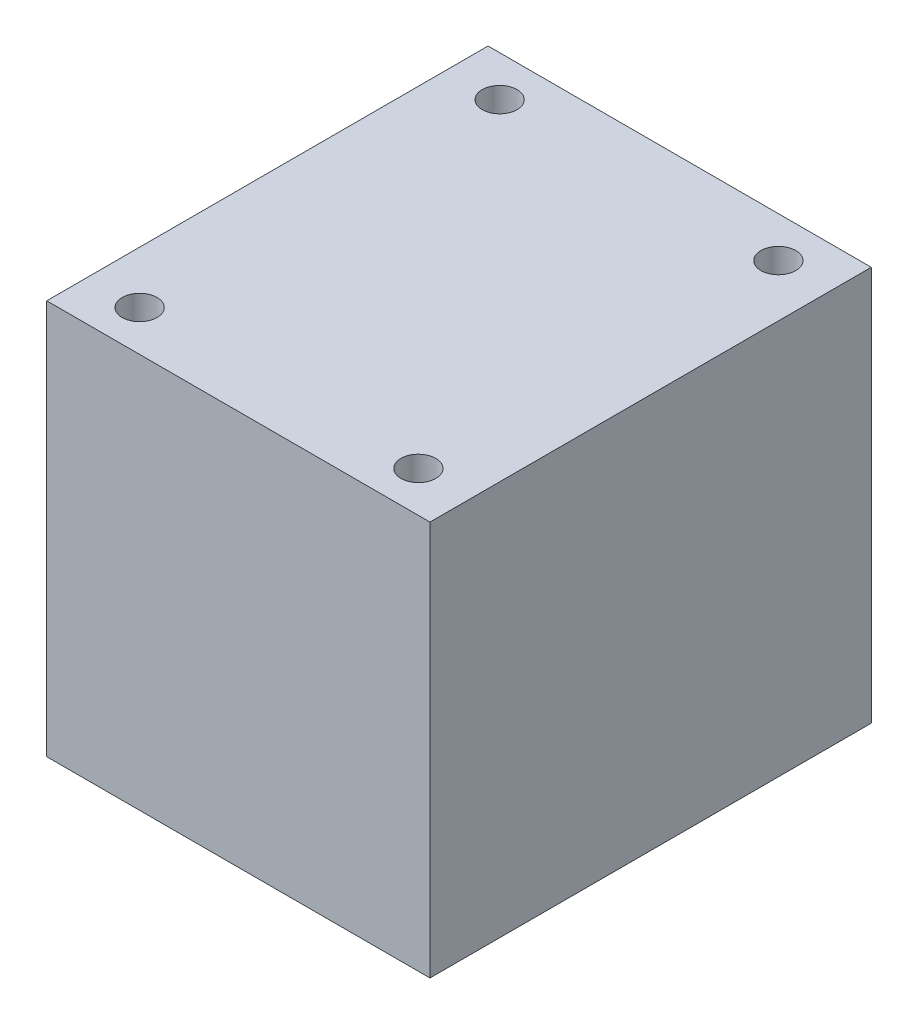
ISO-10303-21;
HEADER;
FILE_DESCRIPTION(('STEP AP214'),'2;1');
FILE_NAME('part.step','',(''),(''),'','','');
FILE_SCHEMA(('AUTOMOTIVE_DESIGN { 1 0 10303 214 1 1 1 1 }'));
ENDSEC;
DATA;
#1=APPLICATION_CONTEXT('core data for automotive mechanical design processes');
#2=APPLICATION_PROTOCOL_DEFINITION('international standard','automotive_design',2000,#1);
#3=PRODUCT_CONTEXT('',#1,'mechanical');
#4=PRODUCT('Part','Part','',(#3));
#5=PRODUCT_RELATED_PRODUCT_CATEGORY('part','',(#4));
#6=PRODUCT_DEFINITION_FORMATION('','',#4);
#7=PRODUCT_DEFINITION_CONTEXT('part definition',#1,'design');
#8=PRODUCT_DEFINITION('design','',#6,#7);
#9=PRODUCT_DEFINITION_SHAPE('','',#8);
#10=(LENGTH_UNIT() NAMED_UNIT(*) SI_UNIT(.MILLI.,.METRE.));
#11=(NAMED_UNIT(*) PLANE_ANGLE_UNIT() SI_UNIT($,.RADIAN.));
#12=(NAMED_UNIT(*) SI_UNIT($,.STERADIAN.) SOLID_ANGLE_UNIT());
#13=UNCERTAINTY_MEASURE_WITH_UNIT(LENGTH_MEASURE(1.E-05),#10,'distance_accuracy_value','');
#14=(GEOMETRIC_REPRESENTATION_CONTEXT(3) GLOBAL_UNCERTAINTY_ASSIGNED_CONTEXT((#13)) GLOBAL_UNIT_ASSIGNED_CONTEXT((#10,
#11,#12)) REPRESENTATION_CONTEXT('',''));
#15=CARTESIAN_POINT('',(0.,0.,0.));
#16=DIRECTION('',(0.,0.,1.));
#17=DIRECTION('',(1.,0.,0.));
#18=AXIS2_PLACEMENT_3D('',#15,#16,#17);
#19=CARTESIAN_POINT('',(0.,34.,0.));
#20=DIRECTION('',(0.,1.,0.));
#21=DIRECTION('',(0.,0.,1.));
#22=AXIS2_PLACEMENT_3D('',#19,#20,#21);
#23=PLANE('',#22);
#24=CARTESIAN_POINT('',(4.5,34.,34.5));
#25=DIRECTION('',(0.,1.,0.));
#26=DIRECTION('',(0.,0.,1.));
#27=AXIS2_PLACEMENT_3D('',#24,#25,#26);
#28=CIRCLE('',#27,1.5);
#29=CARTESIAN_POINT('',(4.5,34.,36.));
#30=VERTEX_POINT('',#29);
#31=EDGE_CURVE('E142',#30,#30,#28,.T.);
#32=ORIENTED_EDGE('',*,*,#31,.F.);
#33=EDGE_LOOP('',(#32));
#34=FACE_BOUND('',#33,.T.);
#35=CARTESIAN_POINT('',(28.5,34.,3.5));
#36=DIRECTION('',(0.,1.,0.));
#37=DIRECTION('',(0.,0.,1.));
#38=AXIS2_PLACEMENT_3D('',#35,#36,#37);
#39=CIRCLE('',#38,1.5);
#40=CARTESIAN_POINT('',(28.5,34.,5.));
#41=VERTEX_POINT('',#40);
#42=EDGE_CURVE('E112',#41,#41,#39,.T.);
#43=ORIENTED_EDGE('',*,*,#42,.F.);
#44=EDGE_LOOP('',(#43));
#45=FACE_BOUND('',#44,.T.);
#46=DIRECTION('',(0.,0.,1.));
#47=VECTOR('',#46,1.);
#48=CARTESIAN_POINT('',(0.,34.,0.));
#49=LINE('',#48,#47);
#50=CARTESIAN_POINT('',(0.,34.,0.));
#51=VERTEX_POINT('',#50);
#52=CARTESIAN_POINT('',(0.,34.,38.));
#53=VERTEX_POINT('',#52);
#54=EDGE_CURVE('E92',#51,#53,#49,.T.);
#55=ORIENTED_EDGE('',*,*,#54,.T.);
#56=DIRECTION('',(1.,0.,0.));
#57=VECTOR('',#56,1.);
#58=CARTESIAN_POINT('',(0.,34.,38.));
#59=LINE('',#58,#57);
#60=CARTESIAN_POINT('',(33.,34.,38.));
#61=VERTEX_POINT('',#60);
#62=EDGE_CURVE('E87',#53,#61,#59,.T.);
#63=ORIENTED_EDGE('',*,*,#62,.T.);
#64=DIRECTION('',(0.,0.,-1.));
#65=VECTOR('',#64,1.);
#66=CARTESIAN_POINT('',(33.,34.,0.));
#67=LINE('',#66,#65);
#68=CARTESIAN_POINT('',(33.,34.,0.));
#69=VERTEX_POINT('',#68);
#70=EDGE_CURVE('E90',#61,#69,#67,.T.);
#71=ORIENTED_EDGE('',*,*,#70,.T.);
#72=DIRECTION('',(-1.,0.,0.));
#73=VECTOR('',#72,1.);
#74=CARTESIAN_POINT('',(0.,34.,0.));
#75=LINE('',#74,#73);
#76=EDGE_CURVE('E57',#69,#51,#75,.T.);
#77=ORIENTED_EDGE('',*,*,#76,.T.);
#78=EDGE_LOOP('',(#55,#63,#71,#77));
#79=FACE_BOUND('',#78,.T.);
#80=CARTESIAN_POINT('',(28.5,34.,34.5));
#81=DIRECTION('',(0.,1.,0.));
#82=DIRECTION('',(0.,0.,1.));
#83=AXIS2_PLACEMENT_3D('',#80,#81,#82);
#84=CIRCLE('',#83,1.5);
#85=CARTESIAN_POINT('',(28.5,34.,36.));
#86=VERTEX_POINT('',#85);
#87=EDGE_CURVE('E134',#86,#86,#84,.T.);
#88=ORIENTED_EDGE('',*,*,#87,.F.);
#89=EDGE_LOOP('',(#88));
#90=FACE_BOUND('',#89,.T.);
#91=CARTESIAN_POINT('',(4.5,34.,3.5));
#92=DIRECTION('',(0.,1.,0.));
#93=DIRECTION('',(0.,0.,1.));
#94=AXIS2_PLACEMENT_3D('',#91,#92,#93);
#95=CIRCLE('',#94,1.5);
#96=CARTESIAN_POINT('',(4.5,34.,5.));
#97=VERTEX_POINT('',#96);
#98=EDGE_CURVE('E150',#97,#97,#95,.T.);
#99=ORIENTED_EDGE('',*,*,#98,.F.);
#100=EDGE_LOOP('',(#99));
#101=FACE_BOUND('',#100,.T.);
#102=ADVANCED_FACE('F39',(#34,#45,#79,#90,#101),#23,.T.);
#103=CARTESIAN_POINT('',(0.,0.,0.));
#104=DIRECTION('',(0.,1.,0.));
#105=DIRECTION('',(0.,0.,1.));
#106=AXIS2_PLACEMENT_3D('',#103,#104,#105);
#107=PLANE('',#106);
#108=DIRECTION('',(0.,0.,1.));
#109=VECTOR('',#108,1.);
#110=CARTESIAN_POINT('',(0.,0.,0.));
#111=LINE('',#110,#109);
#112=CARTESIAN_POINT('',(0.,0.,0.));
#113=VERTEX_POINT('',#112);
#114=CARTESIAN_POINT('',(0.,0.,38.));
#115=VERTEX_POINT('',#114);
#116=EDGE_CURVE('E108',#113,#115,#111,.T.);
#117=ORIENTED_EDGE('',*,*,#116,.F.);
#118=DIRECTION('',(-1.,0.,0.));
#119=VECTOR('',#118,1.);
#120=CARTESIAN_POINT('',(0.,0.,0.));
#121=LINE('',#120,#119);
#122=CARTESIAN_POINT('',(33.,0.,0.));
#123=VERTEX_POINT('',#122);
#124=EDGE_CURVE('E80',#123,#113,#121,.T.);
#125=ORIENTED_EDGE('',*,*,#124,.F.);
#126=DIRECTION('',(0.,0.,-1.));
#127=VECTOR('',#126,1.);
#128=CARTESIAN_POINT('',(33.,0.,0.));
#129=LINE('',#128,#127);
#130=CARTESIAN_POINT('',(33.,0.,38.));
#131=VERTEX_POINT('',#130);
#132=EDGE_CURVE('E74',#131,#123,#129,.T.);
#133=ORIENTED_EDGE('',*,*,#132,.F.);
#134=DIRECTION('',(1.,0.,0.));
#135=VECTOR('',#134,1.);
#136=CARTESIAN_POINT('',(0.,0.,38.));
#137=LINE('',#136,#135);
#138=EDGE_CURVE('E97',#115,#131,#137,.T.);
#139=ORIENTED_EDGE('',*,*,#138,.F.);
#140=EDGE_LOOP('',(#117,#125,#133,#139));
#141=FACE_BOUND('',#140,.T.);
#142=CARTESIAN_POINT('',(28.5,0.,3.5));
#143=DIRECTION('',(0.,1.,0.));
#144=DIRECTION('',(0.,0.,1.));
#145=AXIS2_PLACEMENT_3D('',#142,#143,#144);
#146=CIRCLE('',#145,1.5);
#147=CARTESIAN_POINT('',(28.5,0.,5.));
#148=VERTEX_POINT('',#147);
#149=EDGE_CURVE('E130',#148,#148,#146,.T.);
#150=ORIENTED_EDGE('',*,*,#149,.T.);
#151=EDGE_LOOP('',(#150));
#152=FACE_BOUND('',#151,.T.);
#153=CARTESIAN_POINT('',(28.5,0.,34.5));
#154=DIRECTION('',(0.,1.,0.));
#155=DIRECTION('',(0.,0.,1.));
#156=AXIS2_PLACEMENT_3D('',#153,#154,#155);
#157=CIRCLE('',#156,1.5);
#158=CARTESIAN_POINT('',(28.5,0.,36.));
#159=VERTEX_POINT('',#158);
#160=EDGE_CURVE('E138',#159,#159,#157,.T.);
#161=ORIENTED_EDGE('',*,*,#160,.T.);
#162=EDGE_LOOP('',(#161));
#163=FACE_BOUND('',#162,.T.);
#164=CARTESIAN_POINT('',(4.5,0.,34.5));
#165=DIRECTION('',(0.,1.,0.));
#166=DIRECTION('',(0.,0.,1.));
#167=AXIS2_PLACEMENT_3D('',#164,#165,#166);
#168=CIRCLE('',#167,1.5);
#169=CARTESIAN_POINT('',(4.5,0.,36.));
#170=VERTEX_POINT('',#169);
#171=EDGE_CURVE('E146',#170,#170,#168,.T.);
#172=ORIENTED_EDGE('',*,*,#171,.T.);
#173=EDGE_LOOP('',(#172));
#174=FACE_BOUND('',#173,.T.);
#175=CARTESIAN_POINT('',(4.5,0.,3.5));
#176=DIRECTION('',(0.,1.,0.));
#177=DIRECTION('',(0.,0.,1.));
#178=AXIS2_PLACEMENT_3D('',#175,#176,#177);
#179=CIRCLE('',#178,1.5);
#180=CARTESIAN_POINT('',(4.5,0.,5.));
#181=VERTEX_POINT('',#180);
#182=EDGE_CURVE('E154',#181,#181,#179,.T.);
#183=ORIENTED_EDGE('',*,*,#182,.T.);
#184=EDGE_LOOP('',(#183));
#185=FACE_BOUND('',#184,.T.);
#186=ADVANCED_FACE('F125',(#141,#152,#163,#174,#185),#107,.F.);
#187=CARTESIAN_POINT('',(0.,34.,0.));
#188=DIRECTION('',(1.,0.,0.));
#189=DIRECTION('',(0.,0.,-1.));
#190=AXIS2_PLACEMENT_3D('',#187,#188,#189);
#191=PLANE('',#190);
#192=ORIENTED_EDGE('',*,*,#116,.T.);
#193=DIRECTION('',(0.,-1.,0.));
#194=VECTOR('',#193,1.);
#195=CARTESIAN_POINT('',(0.,34.,38.));
#196=LINE('',#195,#194);
#197=EDGE_CURVE('E11',#53,#115,#196,.T.);
#198=ORIENTED_EDGE('',*,*,#197,.F.);
#199=ORIENTED_EDGE('',*,*,#54,.F.);
#200=DIRECTION('',(0.,-1.,0.));
#201=VECTOR('',#200,1.);
#202=CARTESIAN_POINT('',(0.,34.,0.));
#203=LINE('',#202,#201);
#204=EDGE_CURVE('E104',#51,#113,#203,.T.);
#205=ORIENTED_EDGE('',*,*,#204,.T.);
#206=EDGE_LOOP('',(#192,#198,#199,#205));
#207=FACE_BOUND('',#206,.T.);
#208=ADVANCED_FACE('F41',(#207),#191,.F.);
#209=CARTESIAN_POINT('',(0.,34.,38.));
#210=DIRECTION('',(0.,0.,-1.));
#211=DIRECTION('',(-1.,0.,0.));
#212=AXIS2_PLACEMENT_3D('',#209,#210,#211);
#213=PLANE('',#212);
#214=ORIENTED_EDGE('',*,*,#138,.T.);
#215=DIRECTION('',(0.,-1.,0.));
#216=VECTOR('',#215,1.);
#217=CARTESIAN_POINT('',(33.,34.,38.));
#218=LINE('',#217,#216);
#219=EDGE_CURVE('E49',#61,#131,#218,.T.);
#220=ORIENTED_EDGE('',*,*,#219,.F.);
#221=ORIENTED_EDGE('',*,*,#62,.F.);
#222=ORIENTED_EDGE('',*,*,#197,.T.);
#223=EDGE_LOOP('',(#214,#220,#221,#222));
#224=FACE_BOUND('',#223,.T.);
#225=ADVANCED_FACE('F96',(#224),#213,.F.);
#226=CARTESIAN_POINT('',(33.,34.,0.));
#227=DIRECTION('',(-1.,0.,0.));
#228=DIRECTION('',(0.,0.,1.));
#229=AXIS2_PLACEMENT_3D('',#226,#227,#228);
#230=PLANE('',#229);
#231=ORIENTED_EDGE('',*,*,#132,.T.);
#232=DIRECTION('',(0.,-1.,0.));
#233=VECTOR('',#232,1.);
#234=CARTESIAN_POINT('',(33.,34.,0.));
#235=LINE('',#234,#233);
#236=EDGE_CURVE('E99',#69,#123,#235,.T.);
#237=ORIENTED_EDGE('',*,*,#236,.F.);
#238=ORIENTED_EDGE('',*,*,#70,.F.);
#239=ORIENTED_EDGE('',*,*,#219,.T.);
#240=EDGE_LOOP('',(#231,#237,#238,#239));
#241=FACE_BOUND('',#240,.T.);
#242=ADVANCED_FACE('F100',(#241),#230,.F.);
#243=CARTESIAN_POINT('',(0.,34.,0.));
#244=DIRECTION('',(0.,0.,1.));
#245=DIRECTION('',(1.,0.,0.));
#246=AXIS2_PLACEMENT_3D('',#243,#244,#245);
#247=PLANE('',#246);
#248=ORIENTED_EDGE('',*,*,#124,.T.);
#249=ORIENTED_EDGE('',*,*,#204,.F.);
#250=ORIENTED_EDGE('',*,*,#76,.F.);
#251=ORIENTED_EDGE('',*,*,#236,.T.);
#252=EDGE_LOOP('',(#248,#249,#250,#251));
#253=FACE_BOUND('',#252,.T.);
#254=ADVANCED_FACE('F122',(#253),#247,.F.);
#255=CARTESIAN_POINT('',(28.5,34.,3.5));
#256=DIRECTION('',(0.,-1.,0.));
#257=DIRECTION('',(0.,0.,-1.));
#258=AXIS2_PLACEMENT_3D('',#255,#256,#257);
#259=CYLINDRICAL_SURFACE('',#258,1.5);
#260=ORIENTED_EDGE('',*,*,#42,.T.);
#261=EDGE_LOOP('',(#260));
#262=FACE_BOUND('',#261,.T.);
#263=ORIENTED_EDGE('',*,*,#149,.F.);
#264=EDGE_LOOP('',(#263));
#265=FACE_BOUND('',#264,.T.);
#266=ADVANCED_FACE('F175',(#262,#265),#259,.F.);
#267=CARTESIAN_POINT('',(28.5,34.,34.5));
#268=DIRECTION('',(0.,-1.,0.));
#269=DIRECTION('',(0.,0.,-1.));
#270=AXIS2_PLACEMENT_3D('',#267,#268,#269);
#271=CYLINDRICAL_SURFACE('',#270,1.5);
#272=ORIENTED_EDGE('',*,*,#87,.T.);
#273=EDGE_LOOP('',(#272));
#274=FACE_BOUND('',#273,.T.);
#275=ORIENTED_EDGE('',*,*,#160,.F.);
#276=EDGE_LOOP('',(#275));
#277=FACE_BOUND('',#276,.T.);
#278=ADVANCED_FACE('F221',(#274,#277),#271,.F.);
#279=CARTESIAN_POINT('',(4.5,34.,34.5));
#280=DIRECTION('',(0.,-1.,0.));
#281=DIRECTION('',(0.,0.,-1.));
#282=AXIS2_PLACEMENT_3D('',#279,#280,#281);
#283=CYLINDRICAL_SURFACE('',#282,1.5);
#284=ORIENTED_EDGE('',*,*,#31,.T.);
#285=EDGE_LOOP('',(#284));
#286=FACE_BOUND('',#285,.T.);
#287=ORIENTED_EDGE('',*,*,#171,.F.);
#288=EDGE_LOOP('',(#287));
#289=FACE_BOUND('',#288,.T.);
#290=ADVANCED_FACE('F229',(#286,#289),#283,.F.);
#291=CARTESIAN_POINT('',(4.5,34.,3.5));
#292=DIRECTION('',(0.,-1.,0.));
#293=DIRECTION('',(0.,0.,-1.));
#294=AXIS2_PLACEMENT_3D('',#291,#292,#293);
#295=CYLINDRICAL_SURFACE('',#294,1.5);
#296=ORIENTED_EDGE('',*,*,#98,.T.);
#297=EDGE_LOOP('',(#296));
#298=FACE_BOUND('',#297,.T.);
#299=ORIENTED_EDGE('',*,*,#182,.F.);
#300=EDGE_LOOP('',(#299));
#301=FACE_BOUND('',#300,.T.);
#302=ADVANCED_FACE('F162',(#298,#301),#295,.F.);
#303=CLOSED_SHELL('',(#102,#186,#208,#225,#242,#254,#266,#278,#290,#302));
#304=MANIFOLD_SOLID_BREP('B2',#303);
#305=ADVANCED_BREP_SHAPE_REPRESENTATION('',(#18,#304),#14);
#306=SHAPE_DEFINITION_REPRESENTATION(#9,#305);
ENDSEC;
END-ISO-10303-21;
